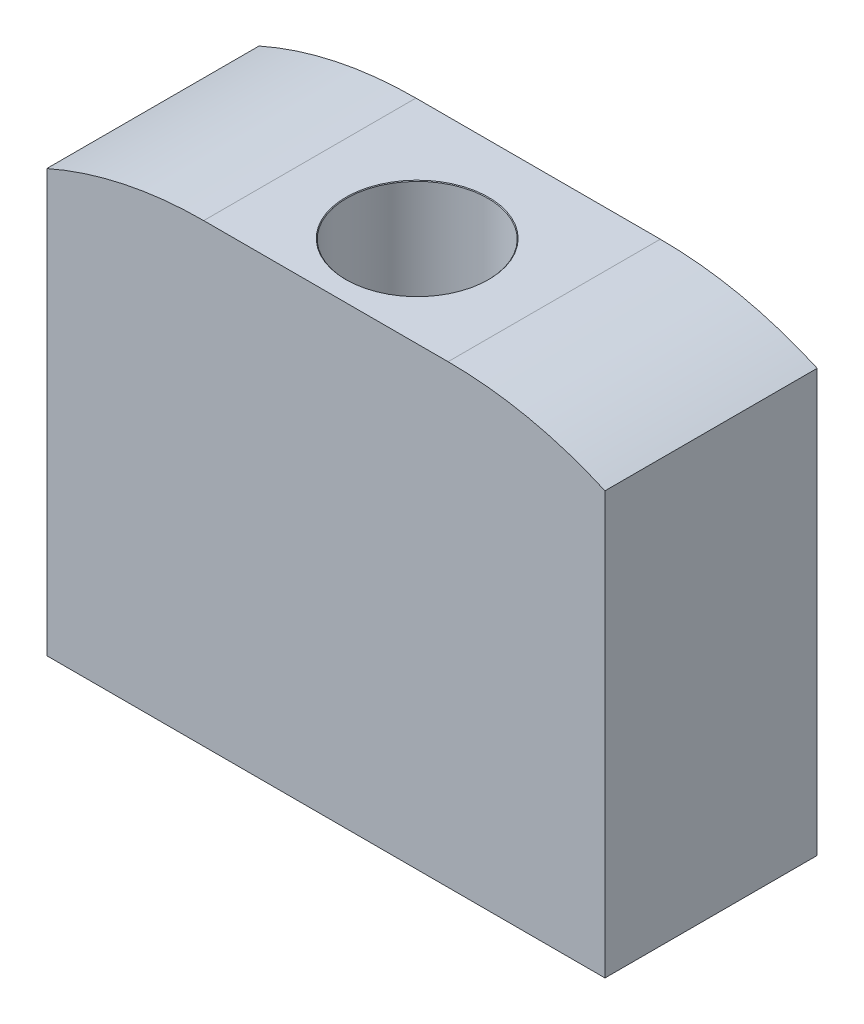
ISO-10303-21;
HEADER;
FILE_DESCRIPTION(('STEP AP214'),'2;1');
FILE_NAME('part.step','',(''),(''),'','','');
FILE_SCHEMA(('AUTOMOTIVE_DESIGN { 1 0 10303 214 1 1 1 1 }'));
ENDSEC;
DATA;
#1=APPLICATION_CONTEXT('core data for automotive mechanical design processes');
#2=APPLICATION_PROTOCOL_DEFINITION('international standard','automotive_design',2000,#1);
#3=PRODUCT_CONTEXT('',#1,'mechanical');
#4=PRODUCT('Part','Part','',(#3));
#5=PRODUCT_RELATED_PRODUCT_CATEGORY('part','',(#4));
#6=PRODUCT_DEFINITION_FORMATION('','',#4);
#7=PRODUCT_DEFINITION_CONTEXT('part definition',#1,'design');
#8=PRODUCT_DEFINITION('design','',#6,#7);
#9=PRODUCT_DEFINITION_SHAPE('','',#8);
#10=(LENGTH_UNIT() NAMED_UNIT(*) SI_UNIT(.MILLI.,.METRE.));
#11=(NAMED_UNIT(*) PLANE_ANGLE_UNIT() SI_UNIT($,.RADIAN.));
#12=(NAMED_UNIT(*) SI_UNIT($,.STERADIAN.) SOLID_ANGLE_UNIT());
#13=UNCERTAINTY_MEASURE_WITH_UNIT(LENGTH_MEASURE(1.E-05),#10,'distance_accuracy_value','');
#14=(GEOMETRIC_REPRESENTATION_CONTEXT(3) GLOBAL_UNCERTAINTY_ASSIGNED_CONTEXT((#13)) GLOBAL_UNIT_ASSIGNED_CONTEXT((#10,
#11,#12)) REPRESENTATION_CONTEXT('',''));
#15=CARTESIAN_POINT('',(0.,0.,0.));
#16=DIRECTION('',(0.,0.,1.));
#17=DIRECTION('',(1.,0.,0.));
#18=AXIS2_PLACEMENT_3D('',#15,#16,#17);
#19=CARTESIAN_POINT('',(-10.85,17.7,4.125));
#20=DIRECTION('',(0.,-1.,0.));
#21=DIRECTION('',(0.,0.,-1.));
#22=AXIS2_PLACEMENT_3D('',#19,#20,#21);
#23=PLANE('',#22);
#24=CARTESIAN_POINT('',(0.,17.7,0.574999999999999));
#25=DIRECTION('',(0.,1.,0.));
#26=DIRECTION('',(0.,0.,1.));
#27=AXIS2_PLACEMENT_3D('',#24,#25,#26);
#28=CIRCLE('',#27,2.775);
#29=CARTESIAN_POINT('',(0.,17.7,3.35));
#30=VERTEX_POINT('',#29);
#31=EDGE_CURVE('E144',#30,#30,#28,.T.);
#32=ORIENTED_EDGE('',*,*,#31,.F.);
#33=EDGE_LOOP('',(#32));
#34=FACE_BOUND('',#33,.T.);
#35=DIRECTION('',(-1.,0.,0.));
#36=VECTOR('',#35,1.);
#37=CARTESIAN_POINT('',(-10.85,17.7,-4.125));
#38=LINE('',#37,#36);
#39=CARTESIAN_POINT('',(4.75,17.7,-4.125));
#40=VERTEX_POINT('',#39);
#41=CARTESIAN_POINT('',(-4.75,17.7,-4.125));
#42=VERTEX_POINT('',#41);
#43=EDGE_CURVE('E117',#40,#42,#38,.T.);
#44=ORIENTED_EDGE('',*,*,#43,.T.);
#45=DIRECTION('',(0.,0.,1.));
#46=VECTOR('',#45,1.);
#47=CARTESIAN_POINT('',(-4.75,17.7,-4.126));
#48=LINE('',#47,#46);
#49=CARTESIAN_POINT('',(-4.75,17.7,4.125));
#50=VERTEX_POINT('',#49);
#51=EDGE_CURVE('E56',#42,#50,#48,.T.);
#52=ORIENTED_EDGE('',*,*,#51,.T.);
#53=DIRECTION('',(-1.,0.,0.));
#54=VECTOR('',#53,1.);
#55=CARTESIAN_POINT('',(-10.85,17.7,4.125));
#56=LINE('',#55,#54);
#57=CARTESIAN_POINT('',(4.75,17.7,4.125));
#58=VERTEX_POINT('',#57);
#59=EDGE_CURVE('E99',#58,#50,#56,.T.);
#60=ORIENTED_EDGE('',*,*,#59,.F.);
#61=DIRECTION('',(0.,0.,1.));
#62=VECTOR('',#61,1.);
#63=CARTESIAN_POINT('',(4.75,17.7,-4.126));
#64=LINE('',#63,#62);
#65=EDGE_CURVE('E84',#40,#58,#64,.T.);
#66=ORIENTED_EDGE('',*,*,#65,.F.);
#67=EDGE_LOOP('',(#44,#52,#60,#66));
#68=FACE_BOUND('',#67,.T.);
#69=ADVANCED_FACE('F33',(#34,#68),#23,.F.);
#70=CARTESIAN_POINT('',(-10.85,0.,4.125));
#71=DIRECTION('',(1.,0.,0.));
#72=DIRECTION('',(0.,0.,-1.));
#73=AXIS2_PLACEMENT_3D('',#70,#71,#72);
#74=PLANE('',#73);
#75=DIRECTION('',(0.,0.,1.));
#76=VECTOR('',#75,1.);
#77=CARTESIAN_POINT('',(-10.85,16.4036491490406,-4.126));
#78=LINE('',#77,#76);
#79=CARTESIAN_POINT('',(-10.85,16.4036491490406,4.125));
#80=VERTEX_POINT('',#79);
#81=CARTESIAN_POINT('',(-10.85,16.4036491490406,-4.125));
#82=VERTEX_POINT('',#81);
#83=EDGE_CURVE('E128',#80,#82,#78,.F.);
#84=ORIENTED_EDGE('',*,*,#83,.T.);
#85=DIRECTION('',(0.,-1.,0.));
#86=VECTOR('',#85,1.);
#87=CARTESIAN_POINT('',(-10.85,0.,-4.125));
#88=LINE('',#87,#86);
#89=CARTESIAN_POINT('',(-10.85,0.,-4.125));
#90=VERTEX_POINT('',#89);
#91=EDGE_CURVE('E110',#82,#90,#88,.T.);
#92=ORIENTED_EDGE('',*,*,#91,.T.);
#93=DIRECTION('',(0.,0.,-1.));
#94=VECTOR('',#93,1.);
#95=CARTESIAN_POINT('',(-10.85,0.,4.125));
#96=LINE('',#95,#94);
#97=CARTESIAN_POINT('',(-10.85,0.,4.125));
#98=VERTEX_POINT('',#97);
#99=EDGE_CURVE('E11',#98,#90,#96,.T.);
#100=ORIENTED_EDGE('',*,*,#99,.F.);
#101=DIRECTION('',(0.,-1.,0.));
#102=VECTOR('',#101,1.);
#103=CARTESIAN_POINT('',(-10.85,0.,4.125));
#104=LINE('',#103,#102);
#105=EDGE_CURVE('E118',#80,#98,#104,.T.);
#106=ORIENTED_EDGE('',*,*,#105,.F.);
#107=EDGE_LOOP('',(#84,#92,#100,#106));
#108=FACE_BOUND('',#107,.T.);
#109=ADVANCED_FACE('F35',(#108),#74,.F.);
#110=CARTESIAN_POINT('',(-10.85,0.,4.125));
#111=DIRECTION('',(0.,1.,0.));
#112=DIRECTION('',(0.,0.,1.));
#113=AXIS2_PLACEMENT_3D('',#110,#111,#112);
#114=PLANE('',#113);
#115=CARTESIAN_POINT('',(0.,0.,0.574999999999999));
#116=DIRECTION('',(0.,1.,0.));
#117=DIRECTION('',(0.,0.,1.));
#118=AXIS2_PLACEMENT_3D('',#115,#116,#117);
#119=CIRCLE('',#118,1.45);
#120=CARTESIAN_POINT('',(0.,0.,2.025));
#121=VERTEX_POINT('',#120);
#122=EDGE_CURVE('E132',#121,#121,#119,.T.);
#123=ORIENTED_EDGE('',*,*,#122,.T.);
#124=EDGE_LOOP('',(#123));
#125=FACE_BOUND('',#124,.T.);
#126=DIRECTION('',(1.,0.,0.));
#127=VECTOR('',#126,1.);
#128=CARTESIAN_POINT('',(-10.85,0.,-4.125));
#129=LINE('',#128,#127);
#130=CARTESIAN_POINT('',(10.85,0.,-4.125));
#131=VERTEX_POINT('',#130);
#132=EDGE_CURVE('E112',#90,#131,#129,.T.);
#133=ORIENTED_EDGE('',*,*,#132,.T.);
#134=DIRECTION('',(0.,0.,-1.));
#135=VECTOR('',#134,1.);
#136=CARTESIAN_POINT('',(10.85,0.,4.125));
#137=LINE('',#136,#135);
#138=CARTESIAN_POINT('',(10.85,0.,4.125));
#139=VERTEX_POINT('',#138);
#140=EDGE_CURVE('E41',#139,#131,#137,.T.);
#141=ORIENTED_EDGE('',*,*,#140,.F.);
#142=DIRECTION('',(1.,0.,0.));
#143=VECTOR('',#142,1.);
#144=CARTESIAN_POINT('',(-10.85,0.,4.125));
#145=LINE('',#144,#143);
#146=EDGE_CURVE('E106',#98,#139,#145,.T.);
#147=ORIENTED_EDGE('',*,*,#146,.F.);
#148=ORIENTED_EDGE('',*,*,#99,.T.);
#149=EDGE_LOOP('',(#133,#141,#147,#148));
#150=FACE_BOUND('',#149,.T.);
#151=ADVANCED_FACE('F155',(#125,#150),#114,.F.);
#152=CARTESIAN_POINT('',(10.85,0.,4.125));
#153=DIRECTION('',(-1.,0.,0.));
#154=DIRECTION('',(0.,0.,1.));
#155=AXIS2_PLACEMENT_3D('',#152,#153,#154);
#156=PLANE('',#155);
#157=DIRECTION('',(0.,0.,1.));
#158=VECTOR('',#157,1.);
#159=CARTESIAN_POINT('',(10.85,16.4036491490406,-4.126));
#160=LINE('',#159,#158);
#161=CARTESIAN_POINT('',(10.85,16.4036491490406,-4.125));
#162=VERTEX_POINT('',#161);
#163=CARTESIAN_POINT('',(10.85,16.4036491490406,4.125));
#164=VERTEX_POINT('',#163);
#165=EDGE_CURVE('E48',#162,#164,#160,.T.);
#166=ORIENTED_EDGE('',*,*,#165,.T.);
#167=DIRECTION('',(0.,1.,0.));
#168=VECTOR('',#167,1.);
#169=CARTESIAN_POINT('',(10.85,0.,4.125));
#170=LINE('',#169,#168);
#171=EDGE_CURVE('E101',#139,#164,#170,.T.);
#172=ORIENTED_EDGE('',*,*,#171,.F.);
#173=ORIENTED_EDGE('',*,*,#140,.T.);
#174=DIRECTION('',(0.,1.,0.));
#175=VECTOR('',#174,1.);
#176=CARTESIAN_POINT('',(10.85,0.,-4.125));
#177=LINE('',#176,#175);
#178=EDGE_CURVE('E114',#131,#162,#177,.T.);
#179=ORIENTED_EDGE('',*,*,#178,.T.);
#180=EDGE_LOOP('',(#166,#172,#173,#179));
#181=FACE_BOUND('',#180,.T.);
#182=ADVANCED_FACE('F161',(#181),#156,.F.);
#183=CARTESIAN_POINT('',(0.,0.,4.125));
#184=DIRECTION('',(0.,0.,-1.));
#185=DIRECTION('',(-1.,0.,0.));
#186=AXIS2_PLACEMENT_3D('',#183,#184,#185);
#187=PLANE('',#186);
#188=CARTESIAN_POINT('',(-4.75,2.7,4.125));
#189=DIRECTION('',(0.,0.,1.));
#190=DIRECTION('',(1.,0.,0.));
#191=AXIS2_PLACEMENT_3D('',#188,#189,#190);
#192=CIRCLE('',#191,15.);
#193=EDGE_CURVE('E102',#50,#80,#192,.T.);
#194=ORIENTED_EDGE('',*,*,#193,.T.);
#195=ORIENTED_EDGE('',*,*,#105,.T.);
#196=ORIENTED_EDGE('',*,*,#146,.T.);
#197=ORIENTED_EDGE('',*,*,#171,.T.);
#198=CARTESIAN_POINT('',(4.75,2.7,4.125));
#199=DIRECTION('',(0.,0.,1.));
#200=DIRECTION('',(1.,0.,0.));
#201=AXIS2_PLACEMENT_3D('',#198,#199,#200);
#202=CIRCLE('',#201,15.);
#203=EDGE_CURVE('E87',#164,#58,#202,.T.);
#204=ORIENTED_EDGE('',*,*,#203,.T.);
#205=ORIENTED_EDGE('',*,*,#59,.T.);
#206=EDGE_LOOP('',(#194,#195,#196,#197,#204,#205));
#207=FACE_BOUND('',#206,.T.);
#208=ADVANCED_FACE('F98',(#207),#187,.F.);
#209=CARTESIAN_POINT('',(0.,0.,-4.125));
#210=DIRECTION('',(0.,0.,-1.));
#211=DIRECTION('',(-1.,0.,0.));
#212=AXIS2_PLACEMENT_3D('',#209,#210,#211);
#213=PLANE('',#212);
#214=ORIENTED_EDGE('',*,*,#91,.F.);
#215=CARTESIAN_POINT('',(-4.75,2.7,-4.125));
#216=DIRECTION('',(0.,0.,-1.));
#217=DIRECTION('',(-1.,0.,0.));
#218=AXIS2_PLACEMENT_3D('',#215,#216,#217);
#219=CIRCLE('',#218,15.);
#220=EDGE_CURVE('E126',#42,#82,#219,.F.);
#221=ORIENTED_EDGE('',*,*,#220,.F.);
#222=ORIENTED_EDGE('',*,*,#43,.F.);
#223=CARTESIAN_POINT('',(4.75,2.7,-4.125));
#224=DIRECTION('',(0.,0.,-1.));
#225=DIRECTION('',(-1.,0.,0.));
#226=AXIS2_PLACEMENT_3D('',#223,#224,#225);
#227=CIRCLE('',#226,15.);
#228=EDGE_CURVE('E88',#162,#40,#227,.F.);
#229=ORIENTED_EDGE('',*,*,#228,.F.);
#230=ORIENTED_EDGE('',*,*,#178,.F.);
#231=ORIENTED_EDGE('',*,*,#132,.F.);
#232=EDGE_LOOP('',(#214,#221,#222,#229,#230,#231));
#233=FACE_BOUND('',#232,.T.);
#234=ADVANCED_FACE('F159',(#233),#213,.T.);
#235=CARTESIAN_POINT('',(4.75,2.7,-4.126));
#236=DIRECTION('',(0.,0.,1.));
#237=DIRECTION('',(1.,0.,0.));
#238=AXIS2_PLACEMENT_3D('',#235,#236,#237);
#239=CYLINDRICAL_SURFACE('',#238,15.);
#240=ORIENTED_EDGE('',*,*,#165,.F.);
#241=ORIENTED_EDGE('',*,*,#228,.T.);
#242=ORIENTED_EDGE('',*,*,#65,.T.);
#243=ORIENTED_EDGE('',*,*,#203,.F.);
#244=EDGE_LOOP('',(#240,#241,#242,#243));
#245=FACE_BOUND('',#244,.T.);
#246=ADVANCED_FACE('F86',(#245),#239,.T.);
#247=CARTESIAN_POINT('',(-4.75,2.7,-4.126));
#248=DIRECTION('',(0.,0.,1.));
#249=DIRECTION('',(1.,0.,0.));
#250=AXIS2_PLACEMENT_3D('',#247,#248,#249);
#251=CYLINDRICAL_SURFACE('',#250,15.);
#252=ORIENTED_EDGE('',*,*,#83,.F.);
#253=ORIENTED_EDGE('',*,*,#193,.F.);
#254=ORIENTED_EDGE('',*,*,#51,.F.);
#255=ORIENTED_EDGE('',*,*,#220,.T.);
#256=EDGE_LOOP('',(#252,#253,#254,#255));
#257=FACE_BOUND('',#256,.T.);
#258=ADVANCED_FACE('F176',(#257),#251,.T.);
#259=CARTESIAN_POINT('',(0.,17.7,0.574999999999999));
#260=DIRECTION('',(0.,1.,0.));
#261=DIRECTION('',(0.,0.,1.));
#262=AXIS2_PLACEMENT_3D('',#259,#260,#261);
#263=CYLINDRICAL_SURFACE('',#262,1.45);
#264=ORIENTED_EDGE('',*,*,#122,.F.);
#265=EDGE_LOOP('',(#264));
#266=FACE_BOUND('',#265,.T.);
#267=CARTESIAN_POINT('',(0.,5.2,0.574999999999999));
#268=DIRECTION('',(0.,1.,0.));
#269=DIRECTION('',(0.,0.,1.));
#270=AXIS2_PLACEMENT_3D('',#267,#268,#269);
#271=CIRCLE('',#270,1.45);
#272=CARTESIAN_POINT('',(0.,5.2,2.025));
#273=VERTEX_POINT('',#272);
#274=EDGE_CURVE('E135',#273,#273,#271,.T.);
#275=ORIENTED_EDGE('',*,*,#274,.T.);
#276=EDGE_LOOP('',(#275));
#277=FACE_BOUND('',#276,.T.);
#278=ADVANCED_FACE('F178',(#266,#277),#263,.F.);
#279=CARTESIAN_POINT('',(2.75,5.2,0.574999999999999));
#280=DIRECTION('',(0.,-1.,0.));
#281=DIRECTION('',(0.,0.,-1.));
#282=AXIS2_PLACEMENT_3D('',#279,#280,#281);
#283=PLANE('',#282);
#284=ORIENTED_EDGE('',*,*,#274,.F.);
#285=EDGE_LOOP('',(#284));
#286=FACE_BOUND('',#285,.T.);
#287=CARTESIAN_POINT('',(0.,5.2,0.574999999999999));
#288=DIRECTION('',(0.,1.,0.));
#289=DIRECTION('',(0.,0.,1.));
#290=AXIS2_PLACEMENT_3D('',#287,#288,#289);
#291=CIRCLE('',#290,2.75);
#292=CARTESIAN_POINT('',(0.,5.2,3.325));
#293=VERTEX_POINT('',#292);
#294=EDGE_CURVE('E138',#293,#293,#291,.T.);
#295=ORIENTED_EDGE('',*,*,#294,.T.);
#296=EDGE_LOOP('',(#295));
#297=FACE_BOUND('',#296,.T.);
#298=ADVANCED_FACE('F184',(#286,#297),#283,.F.);
#299=CARTESIAN_POINT('',(0.,17.7,0.574999999999999));
#300=DIRECTION('',(0.,1.,0.));
#301=DIRECTION('',(0.,0.,1.));
#302=AXIS2_PLACEMENT_3D('',#299,#300,#301);
#303=CYLINDRICAL_SURFACE('',#302,2.75);
#304=ORIENTED_EDGE('',*,*,#294,.F.);
#305=EDGE_LOOP('',(#304));
#306=FACE_BOUND('',#305,.T.);
#307=CARTESIAN_POINT('',(0.,17.675,0.574999999999999));
#308=DIRECTION('',(0.,1.,0.));
#309=DIRECTION('',(0.,0.,1.));
#310=AXIS2_PLACEMENT_3D('',#307,#308,#309);
#311=CIRCLE('',#310,2.75);
#312=CARTESIAN_POINT('',(0.,17.675,3.325));
#313=VERTEX_POINT('',#312);
#314=EDGE_CURVE('E141',#313,#313,#311,.T.);
#315=ORIENTED_EDGE('',*,*,#314,.T.);
#316=EDGE_LOOP('',(#315));
#317=FACE_BOUND('',#316,.T.);
#318=ADVANCED_FACE('F227',(#306,#317),#303,.F.);
#319=CARTESIAN_POINT('',(0.,17.7,0.574999999999999));
#320=DIRECTION('',(0.,1.,0.));
#321=DIRECTION('',(0.,0.,1.));
#322=AXIS2_PLACEMENT_3D('',#319,#320,#321);
#323=CONICAL_SURFACE('',#322,2.775,0.785398163397448);
#324=ORIENTED_EDGE('',*,*,#314,.F.);
#325=EDGE_LOOP('',(#324));
#326=FACE_BOUND('',#325,.T.);
#327=ORIENTED_EDGE('',*,*,#31,.T.);
#328=EDGE_LOOP('',(#327));
#329=FACE_BOUND('',#328,.T.);
#330=ADVANCED_FACE('F148',(#326,#329),#323,.F.);
#331=CLOSED_SHELL('',(#69,#109,#151,#182,#208,#234,#246,#258,#278,#298,#318,#330));
#332=MANIFOLD_SOLID_BREP('B2',#331);
#333=ADVANCED_BREP_SHAPE_REPRESENTATION('',(#18,#332),#14);
#334=SHAPE_DEFINITION_REPRESENTATION(#9,#333);
ENDSEC;
END-ISO-10303-21;
